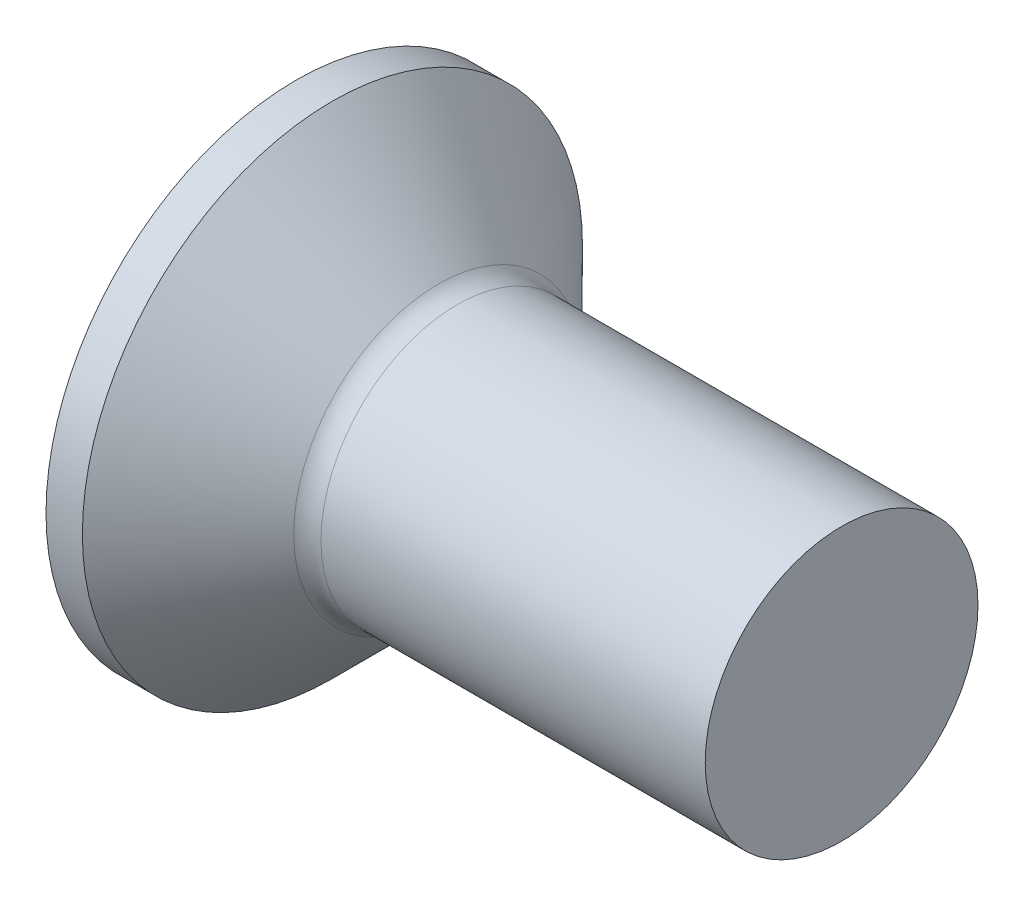
ISO-10303-21;
HEADER;
FILE_DESCRIPTION(('STEP AP214'),'2;1');
FILE_NAME('part.step','',(''),(''),'','','');
FILE_SCHEMA(('AUTOMOTIVE_DESIGN { 1 0 10303 214 1 1 1 1 }'));
ENDSEC;
DATA;
#1=APPLICATION_CONTEXT('core data for automotive mechanical design processes');
#2=APPLICATION_PROTOCOL_DEFINITION('international standard','automotive_design',2000,#1);
#3=PRODUCT_CONTEXT('',#1,'mechanical');
#4=PRODUCT('Part','Part','',(#3));
#5=PRODUCT_RELATED_PRODUCT_CATEGORY('part','',(#4));
#6=PRODUCT_DEFINITION_FORMATION('','',#4);
#7=PRODUCT_DEFINITION_CONTEXT('part definition',#1,'design');
#8=PRODUCT_DEFINITION('design','',#6,#7);
#9=PRODUCT_DEFINITION_SHAPE('','',#8);
#10=(LENGTH_UNIT() NAMED_UNIT(*) SI_UNIT(.MILLI.,.METRE.));
#11=(NAMED_UNIT(*) PLANE_ANGLE_UNIT() SI_UNIT($,.RADIAN.));
#12=(NAMED_UNIT(*) SI_UNIT($,.STERADIAN.) SOLID_ANGLE_UNIT());
#13=UNCERTAINTY_MEASURE_WITH_UNIT(LENGTH_MEASURE(1.E-05),#10,'distance_accuracy_value','');
#14=(GEOMETRIC_REPRESENTATION_CONTEXT(3) GLOBAL_UNCERTAINTY_ASSIGNED_CONTEXT((#13)) GLOBAL_UNIT_ASSIGNED_CONTEXT((#10,
#11,#12)) REPRESENTATION_CONTEXT('',''));
#15=CARTESIAN_POINT('',(0.,0.,0.));
#16=DIRECTION('',(0.,0.,1.));
#17=DIRECTION('',(1.,0.,0.));
#18=AXIS2_PLACEMENT_3D('',#15,#16,#17);
#19=CARTESIAN_POINT('',(0.,0.,0.));
#20=DIRECTION('',(1.,0.,0.));
#21=DIRECTION('',(0.,0.,-1.));
#22=AXIS2_PLACEMENT_3D('',#19,#20,#21);
#23=PLANE('',#22);
#24=CARTESIAN_POINT('',(0.,0.,0.));
#25=DIRECTION('',(-1.,0.,0.));
#26=DIRECTION('',(0.,0.,1.));
#27=AXIS2_PLACEMENT_3D('',#24,#25,#26);
#28=CIRCLE('',#27,2.75);
#29=CARTESIAN_POINT('',(0.,0.,2.75));
#30=VERTEX_POINT('',#29);
#31=EDGE_CURVE('E732',#30,#30,#28,.T.);
#32=ORIENTED_EDGE('',*,*,#31,.T.);
#33=EDGE_LOOP('',(#32));
#34=FACE_BOUND('',#33,.T.);
#35=CARTESIAN_POINT('',(0.,0.,0.));
#36=DIRECTION('',(-1.,0.,0.));
#37=DIRECTION('',(0.,0.,1.));
#38=AXIS2_PLACEMENT_3D('',#35,#36,#37);
#39=CIRCLE('',#38,0.7623);
#40=CARTESIAN_POINT('',(0.,-0.346499999999998,-0.678998556699498));
#41=VERTEX_POINT('',#40);
#42=CARTESIAN_POINT('',(0.,-0.678998556699496,-0.346500000000001));
#43=VERTEX_POINT('',#42);
#44=EDGE_CURVE('E634',#41,#43,#39,.T.);
#45=ORIENTED_EDGE('',*,*,#44,.F.);
#46=DIRECTION('',(0.,0.,1.));
#47=VECTOR('',#46,1.);
#48=CARTESIAN_POINT('',(0.,-0.346500000000005,1.575));
#49=LINE('',#48,#47);
#50=CARTESIAN_POINT('',(0.,-0.346499999999995,-1.575));
#51=VERTEX_POINT('',#50);
#52=EDGE_CURVE('E429',#51,#41,#49,.T.);
#53=ORIENTED_EDGE('',*,*,#52,.F.);
#54=DIRECTION('',(0.,-1.,0.));
#55=VECTOR('',#54,1.);
#56=CARTESIAN_POINT('',(0.,0.346500000000005,-1.575));
#57=LINE('',#56,#55);
#58=CARTESIAN_POINT('',(0.,0.346500000000005,-1.575));
#59=VERTEX_POINT('',#58);
#60=EDGE_CURVE('E227',#59,#51,#57,.T.);
#61=ORIENTED_EDGE('',*,*,#60,.F.);
#62=DIRECTION('',(0.,0.,-1.));
#63=VECTOR('',#62,1.);
#64=CARTESIAN_POINT('',(0.,0.346499999999995,1.575));
#65=LINE('',#64,#63);
#66=CARTESIAN_POINT('',(0.,0.346500000000003,-0.678998556699495));
#67=VERTEX_POINT('',#66);
#68=EDGE_CURVE('E439',#67,#59,#65,.T.);
#69=ORIENTED_EDGE('',*,*,#68,.F.);
#70=CARTESIAN_POINT('',(0.,0.678998556699496,-0.3465));
#71=VERTEX_POINT('',#70);
#72=EDGE_CURVE('E632',#71,#67,#39,.T.);
#73=ORIENTED_EDGE('',*,*,#72,.F.);
#74=DIRECTION('',(0.,-1.,0.));
#75=VECTOR('',#74,1.);
#76=CARTESIAN_POINT('',(0.,1.575,-0.3465));
#77=LINE('',#76,#75);
#78=CARTESIAN_POINT('',(0.,1.575,-0.3465));
#79=VERTEX_POINT('',#78);
#80=EDGE_CURVE('E564',#79,#71,#77,.T.);
#81=ORIENTED_EDGE('',*,*,#80,.F.);
#82=DIRECTION('',(0.,0.,-1.));
#83=VECTOR('',#82,1.);
#84=CARTESIAN_POINT('',(0.,1.575,-0.3465));
#85=LINE('',#84,#83);
#86=CARTESIAN_POINT('',(0.,1.575,0.3465));
#87=VERTEX_POINT('',#86);
#88=EDGE_CURVE('E661',#87,#79,#85,.T.);
#89=ORIENTED_EDGE('',*,*,#88,.F.);
#90=DIRECTION('',(0.,1.,0.));
#91=VECTOR('',#90,1.);
#92=CARTESIAN_POINT('',(0.,1.575,0.3465));
#93=LINE('',#92,#91);
#94=CARTESIAN_POINT('',(0.,0.678998556699497,0.3465));
#95=VERTEX_POINT('',#94);
#96=EDGE_CURVE('E78',#95,#87,#93,.T.);
#97=ORIENTED_EDGE('',*,*,#96,.F.);
#98=CARTESIAN_POINT('',(0.,0.346499999999998,0.678998556699498));
#99=VERTEX_POINT('',#98);
#100=EDGE_CURVE('E629',#99,#95,#39,.T.);
#101=ORIENTED_EDGE('',*,*,#100,.F.);
#102=CARTESIAN_POINT('',(0.,0.346499999999995,1.575));
#103=VERTEX_POINT('',#102);
#104=EDGE_CURVE('E427',#103,#99,#65,.T.);
#105=ORIENTED_EDGE('',*,*,#104,.F.);
#106=DIRECTION('',(0.,1.,0.));
#107=VECTOR('',#106,1.);
#108=CARTESIAN_POINT('',(0.,0.346499999999995,1.575));
#109=LINE('',#108,#107);
#110=CARTESIAN_POINT('',(0.,-0.346500000000005,1.575));
#111=VERTEX_POINT('',#110);
#112=EDGE_CURVE('E359',#111,#103,#109,.T.);
#113=ORIENTED_EDGE('',*,*,#112,.F.);
#114=CARTESIAN_POINT('',(0.,-0.346500000000002,0.678998556699496));
#115=VERTEX_POINT('',#114);
#116=EDGE_CURVE('E426',#115,#111,#49,.T.);
#117=ORIENTED_EDGE('',*,*,#116,.F.);
#118=CARTESIAN_POINT('',(0.,-0.678998556699497,0.3465));
#119=VERTEX_POINT('',#118);
#120=EDGE_CURVE('E607',#119,#115,#39,.T.);
#121=ORIENTED_EDGE('',*,*,#120,.F.);
#122=CARTESIAN_POINT('',(0.,-1.575,0.3465));
#123=VERTEX_POINT('',#122);
#124=EDGE_CURVE('E645',#123,#119,#93,.T.);
#125=ORIENTED_EDGE('',*,*,#124,.F.);
#126=DIRECTION('',(0.,0.,1.));
#127=VECTOR('',#126,1.);
#128=CARTESIAN_POINT('',(0.,-1.575,-0.3465));
#129=LINE('',#128,#127);
#130=CARTESIAN_POINT('',(0.,-1.575,-0.3465));
#131=VERTEX_POINT('',#130);
#132=EDGE_CURVE('E557',#131,#123,#129,.T.);
#133=ORIENTED_EDGE('',*,*,#132,.F.);
#134=EDGE_CURVE('E561',#43,#131,#77,.T.);
#135=ORIENTED_EDGE('',*,*,#134,.F.);
#136=EDGE_LOOP('',(#45,#53,#61,#69,#73,#81,#89,#97,#101,#105,#113,#117,#121,#125,#133,#135));
#137=FACE_BOUND('',#136,.T.);
#138=ADVANCED_FACE('F52',(#34,#137),#23,.F.);
#139=CARTESIAN_POINT('',(1.86,-0.647638364104692,0.3465));
#140=DIRECTION('',(0.,0.,-1.));
#141=DIRECTION('',(-1.,0.,0.));
#142=AXIS2_PLACEMENT_3D('',#139,#140,#141);
#143=PLANE('',#142);
#144=ORIENTED_EDGE('',*,*,#124,.T.);
#145=CARTESIAN_POINT('',(-0.000199999999999989,-0.679014257787779,0.3465));
#146=CARTESIAN_POINT('',(0.236606189027903,-0.660413380015154,0.3465));
#147=CARTESIAN_POINT('',(0.473401828028878,-0.641674112311925,0.3465));
#148=CARTESIAN_POINT('',(0.946959624916106,-0.603785736586839,0.3465));
#149=CARTESIAN_POINT('',(1.18372178289219,-0.584636629686428,0.3465));
#150=CARTESIAN_POINT('',(1.56705011284707,-0.553190853912894,0.3465));
#151=CARTESIAN_POINT('',(1.71363002451431,-0.541061591176943,0.3465));
#152=CARTESIAN_POINT('',(1.8602,-0.528812433570195,0.3465));
#153=B_SPLINE_CURVE_WITH_KNOTS('',3,(#145,#146,#147,#148,#149,#150,#151,#152),.UNSPECIFIED.,.F.,
.F.,(4,2,2,4),(0.,0.712607301280214,1.42521265289613,1.86645525161499),.UNSPECIFIED.);
#154=CARTESIAN_POINT('',(1.86,-0.528829153702424,0.346499999999999));
#155=VERTEX_POINT('',#154);
#156=EDGE_CURVE('E334',#119,#155,#153,.T.);
#157=ORIENTED_EDGE('',*,*,#156,.T.);
#158=DIRECTION('',(0.,-1.,0.));
#159=VECTOR('',#158,1.);
#160=CARTESIAN_POINT('',(1.86,0.647638364104693,0.3465));
#161=LINE('',#160,#159);
#162=CARTESIAN_POINT('',(1.86,-0.647638364104692,0.3465));
#163=VERTEX_POINT('',#162);
#164=EDGE_CURVE('E537',#155,#163,#161,.T.);
#165=ORIENTED_EDGE('',*,*,#164,.T.);
#166=DIRECTION('',(0.894934391398442,0.446197753347436,0.));
#167=VECTOR('',#166,1.);
#168=CARTESIAN_POINT('',(0.,-1.575,0.3465));
#169=LINE('',#168,#167);
#170=EDGE_CURVE('E555',#123,#163,#169,.T.);
#171=ORIENTED_EDGE('',*,*,#170,.F.);
#172=EDGE_LOOP('',(#144,#157,#165,#171));
#173=FACE_BOUND('',#172,.T.);
#174=ADVANCED_FACE('F184',(#173),#143,.T.);
#175=CARTESIAN_POINT('',(1.86,0.647638364104693,0.3465));
#176=VERTEX_POINT('',#175);
#177=CARTESIAN_POINT('',(1.86,0.528829153702424,0.346499999999999));
#178=VERTEX_POINT('',#177);
#179=EDGE_CURVE('E534',#176,#178,#161,.T.);
#180=ORIENTED_EDGE('',*,*,#179,.T.);
#181=CARTESIAN_POINT('',(1.8602,0.528812433570195,0.3465));
#182=CARTESIAN_POINT('',(1.66388483871382,0.545218893036116,0.3465));
#183=CARTESIAN_POINT('',(1.46755175904104,0.561409078584737,0.3465));
#184=CARTESIAN_POINT('',(1.07485715491275,0.593436471085346,0.3465));
#185=CARTESIAN_POINT('',(0.878495630510803,0.609273678693523,0.3465));
#186=CARTESIAN_POINT('',(0.568409491805524,0.634065947381106,0.3465));
#187=CARTESIAN_POINT('',(0.454692116755951,0.643111852686441,0.3465));
#188=CARTESIAN_POINT('',(0.227250769123921,0.661121904170995,0.3465));
#189=CARTESIAN_POINT('',(0.113526796534547,0.670086050262893,0.3465));
#190=CARTESIAN_POINT('',(-0.000199999999999985,0.679014257787779,0.3465));
#191=B_SPLINE_CURVE_WITH_KNOTS('',3,(#181,#182,#183,#184,#185,#186,#187,#188,#189,#190),
.UNSPECIFIED.,.F.,.F.,(4,2,2,2,4),(0.,0.590998249941937,1.1819954011213,1.52422516902128,
1.86645530239),.UNSPECIFIED.);
#192=EDGE_CURVE('E333',#178,#95,#191,.T.);
#193=ORIENTED_EDGE('',*,*,#192,.T.);
#194=ORIENTED_EDGE('',*,*,#96,.T.);
#195=DIRECTION('',(0.894934391398443,-0.446197753347436,0.));
#196=VECTOR('',#195,1.);
#197=CARTESIAN_POINT('',(0.,1.575,0.3465));
#198=LINE('',#197,#196);
#199=EDGE_CURVE('E595',#87,#176,#198,.T.);
#200=ORIENTED_EDGE('',*,*,#199,.T.);
#201=EDGE_LOOP('',(#180,#193,#194,#200));
#202=FACE_BOUND('',#201,.T.);
#203=ADVANCED_FACE('F189',(#202),#143,.T.);
#204=CARTESIAN_POINT('',(1.86,0.647638364104692,-0.3465));
#205=DIRECTION('',(0.,0.,1.));
#206=DIRECTION('',(0.,-1.,0.));
#207=AXIS2_PLACEMENT_3D('',#204,#205,#206);
#208=PLANE('',#207);
#209=DIRECTION('',(0.,1.,0.));
#210=VECTOR('',#209,1.);
#211=CARTESIAN_POINT('',(1.86,0.647638364104693,-0.3465));
#212=LINE('',#211,#210);
#213=CARTESIAN_POINT('',(1.86,-0.647638364104693,-0.3465));
#214=VERTEX_POINT('',#213);
#215=CARTESIAN_POINT('',(1.86,-0.528829153702424,-0.3465));
#216=VERTEX_POINT('',#215);
#217=EDGE_CURVE('E409',#214,#216,#212,.T.);
#218=ORIENTED_EDGE('',*,*,#217,.T.);
#219=CARTESIAN_POINT('',(1.8602,-0.528812433570194,-0.3465));
#220=CARTESIAN_POINT('',(1.66388483871382,-0.545218893036116,-0.3465));
#221=CARTESIAN_POINT('',(1.46755175904104,-0.561409078584736,-0.3465));
#222=CARTESIAN_POINT('',(1.07485715491275,-0.593436471085345,-0.3465));
#223=CARTESIAN_POINT('',(0.878495630510803,-0.609273678693523,-0.3465));
#224=CARTESIAN_POINT('',(0.568409491805524,-0.634065947381106,-0.3465));
#225=CARTESIAN_POINT('',(0.454692116755951,-0.643111852686441,-0.3465));
#226=CARTESIAN_POINT('',(0.227250769123921,-0.661121904170995,-0.3465));
#227=CARTESIAN_POINT('',(0.113526796534547,-0.670086050262893,-0.3465));
#228=CARTESIAN_POINT('',(-0.000199999999999997,-0.679014257787779,-0.3465));
#229=B_SPLINE_CURVE_WITH_KNOTS('',3,(#219,#220,#221,#222,#223,#224,#225,#226,#227,#228),
.UNSPECIFIED.,.F.,.F.,(4,2,2,2,4),(0.,0.590998249941937,1.1819954011213,1.52422516902128,
1.86645530239),.UNSPECIFIED.);
#230=EDGE_CURVE('E639',#216,#43,#229,.T.);
#231=ORIENTED_EDGE('',*,*,#230,.T.);
#232=ORIENTED_EDGE('',*,*,#134,.T.);
#233=DIRECTION('',(0.894934391398442,0.446197753347436,0.));
#234=VECTOR('',#233,1.);
#235=CARTESIAN_POINT('',(0.,-1.575,-0.3465));
#236=LINE('',#235,#234);
#237=EDGE_CURVE('E562',#131,#214,#236,.T.);
#238=ORIENTED_EDGE('',*,*,#237,.T.);
#239=EDGE_LOOP('',(#218,#231,#232,#238));
#240=FACE_BOUND('',#239,.T.);
#241=ADVANCED_FACE('F339',(#240),#208,.T.);
#242=ORIENTED_EDGE('',*,*,#80,.T.);
#243=CARTESIAN_POINT('',(-0.0002,0.679014257787778,-0.3465));
#244=CARTESIAN_POINT('',(0.236606189027903,0.660413380015153,-0.3465));
#245=CARTESIAN_POINT('',(0.473401828028878,0.641674112311924,-0.3465));
#246=CARTESIAN_POINT('',(0.946959624916106,0.603785736586838,-0.3465));
#247=CARTESIAN_POINT('',(1.18372178289219,0.584636629686428,-0.3465));
#248=CARTESIAN_POINT('',(1.56705011284707,0.553190853912894,-0.3465));
#249=CARTESIAN_POINT('',(1.71363002451431,0.541061591176943,-0.3465));
#250=CARTESIAN_POINT('',(1.8602,0.528812433570195,-0.3465));
#251=B_SPLINE_CURVE_WITH_KNOTS('',3,(#243,#244,#245,#246,#247,#248,#249,#250),.UNSPECIFIED.,.F.,
.F.,(4,2,2,4),(0.,0.712607301280214,1.42521265289613,1.86645525161499),.UNSPECIFIED.);
#252=CARTESIAN_POINT('',(1.86,0.528829153702424,-0.3465));
#253=VERTEX_POINT('',#252);
#254=EDGE_CURVE('E644',#71,#253,#251,.T.);
#255=ORIENTED_EDGE('',*,*,#254,.T.);
#256=CARTESIAN_POINT('',(1.86,0.647638364104693,-0.3465));
#257=VERTEX_POINT('',#256);
#258=EDGE_CURVE('E538',#253,#257,#212,.T.);
#259=ORIENTED_EDGE('',*,*,#258,.T.);
#260=DIRECTION('',(0.894934391398443,-0.446197753347436,0.));
#261=VECTOR('',#260,1.);
#262=CARTESIAN_POINT('',(0.,1.575,-0.3465));
#263=LINE('',#262,#261);
#264=EDGE_CURVE('E565',#79,#257,#263,.T.);
#265=ORIENTED_EDGE('',*,*,#264,.F.);
#266=EDGE_LOOP('',(#242,#255,#259,#265));
#267=FACE_BOUND('',#266,.T.);
#268=ADVANCED_FACE('F465',(#267),#208,.T.);
#269=CARTESIAN_POINT('',(1.86,0.647638364104693,-0.3465));
#270=DIRECTION('',(-1.,0.,0.));
#271=DIRECTION('',(0.,0.,1.));
#272=AXIS2_PLACEMENT_3D('',#269,#270,#271);
#273=PLANE('',#272);
#274=ORIENTED_EDGE('',*,*,#164,.F.);
#275=CARTESIAN_POINT('',(1.86,0.,0.));
#276=DIRECTION('',(-1.,0.,0.));
#277=DIRECTION('',(0.,0.,1.));
#278=AXIS2_PLACEMENT_3D('',#275,#276,#277);
#279=CIRCLE('',#278,0.632236129785084);
#280=EDGE_CURVE('E619',#216,#155,#279,.T.);
#281=ORIENTED_EDGE('',*,*,#280,.F.);
#282=ORIENTED_EDGE('',*,*,#217,.F.);
#283=DIRECTION('',(0.,0.,-1.));
#284=VECTOR('',#283,1.);
#285=CARTESIAN_POINT('',(1.86,-0.647638364104693,-0.3465));
#286=LINE('',#285,#284);
#287=EDGE_CURVE('E543',#163,#214,#286,.T.);
#288=ORIENTED_EDGE('',*,*,#287,.F.);
#289=EDGE_LOOP('',(#274,#281,#282,#288));
#290=FACE_BOUND('',#289,.T.);
#291=ADVANCED_FACE('F455',(#290),#273,.T.);
#292=DIRECTION('',(0.,0.,-1.));
#293=VECTOR('',#292,1.);
#294=CARTESIAN_POINT('',(1.86,-0.346500000000002,0.647638364104691));
#295=LINE('',#294,#293);
#296=CARTESIAN_POINT('',(1.86,-0.346499999999998,-0.528829153702425));
#297=VERTEX_POINT('',#296);
#298=CARTESIAN_POINT('',(1.86,-0.346499999999997,-0.647638364104694));
#299=VERTEX_POINT('',#298);
#300=EDGE_CURVE('E396',#297,#299,#295,.T.);
#301=ORIENTED_EDGE('',*,*,#300,.F.);
#302=CARTESIAN_POINT('',(1.86,0.346500000000002,-0.528829153702422));
#303=VERTEX_POINT('',#302);
#304=EDGE_CURVE('E609',#303,#297,#279,.T.);
#305=ORIENTED_EDGE('',*,*,#304,.F.);
#306=DIRECTION('',(0.,0.,1.));
#307=VECTOR('',#306,1.);
#308=CARTESIAN_POINT('',(1.86,0.346499999999998,0.647638364104694));
#309=LINE('',#308,#307);
#310=CARTESIAN_POINT('',(1.86,0.346500000000003,-0.647638364104691));
#311=VERTEX_POINT('',#310);
#312=EDGE_CURVE('E403',#311,#303,#309,.T.);
#313=ORIENTED_EDGE('',*,*,#312,.F.);
#314=DIRECTION('',(0.,1.,0.));
#315=VECTOR('',#314,1.);
#316=CARTESIAN_POINT('',(1.86,0.346500000000003,-0.647638364104691));
#317=LINE('',#316,#315);
#318=EDGE_CURVE('E398',#299,#311,#317,.T.);
#319=ORIENTED_EDGE('',*,*,#318,.F.);
#320=EDGE_LOOP('',(#301,#305,#313,#319));
#321=FACE_BOUND('',#320,.T.);
#322=ADVANCED_FACE('F464',(#321),#273,.T.);
#323=ORIENTED_EDGE('',*,*,#258,.F.);
#324=EDGE_CURVE('E601',#178,#253,#279,.T.);
#325=ORIENTED_EDGE('',*,*,#324,.F.);
#326=ORIENTED_EDGE('',*,*,#179,.F.);
#327=DIRECTION('',(0.,0.,1.));
#328=VECTOR('',#327,1.);
#329=CARTESIAN_POINT('',(1.86,0.647638364104693,-0.3465));
#330=LINE('',#329,#328);
#331=EDGE_CURVE('E536',#257,#176,#330,.T.);
#332=ORIENTED_EDGE('',*,*,#331,.F.);
#333=EDGE_LOOP('',(#323,#325,#326,#332));
#334=FACE_BOUND('',#333,.T.);
#335=ADVANCED_FACE('F599',(#334),#273,.T.);
#336=CARTESIAN_POINT('',(1.86,0.346499999999998,0.528829153702426));
#337=VERTEX_POINT('',#336);
#338=CARTESIAN_POINT('',(1.86,0.346499999999998,0.647638364104694));
#339=VERTEX_POINT('',#338);
#340=EDGE_CURVE('E524',#337,#339,#309,.T.);
#341=ORIENTED_EDGE('',*,*,#340,.F.);
#342=CARTESIAN_POINT('',(1.86,-0.346500000000002,0.528829153702423));
#343=VERTEX_POINT('',#342);
#344=EDGE_CURVE('E525',#343,#337,#279,.T.);
#345=ORIENTED_EDGE('',*,*,#344,.F.);
#346=CARTESIAN_POINT('',(1.86,-0.346500000000002,0.647638364104691));
#347=VERTEX_POINT('',#346);
#348=EDGE_CURVE('E56',#347,#343,#295,.T.);
#349=ORIENTED_EDGE('',*,*,#348,.F.);
#350=DIRECTION('',(0.,-1.,0.));
#351=VECTOR('',#350,1.);
#352=CARTESIAN_POINT('',(1.86,0.346499999999998,0.647638364104694));
#353=LINE('',#352,#351);
#354=EDGE_CURVE('E395',#339,#347,#353,.T.);
#355=ORIENTED_EDGE('',*,*,#354,.F.);
#356=EDGE_LOOP('',(#341,#345,#349,#355));
#357=FACE_BOUND('',#356,.T.);
#358=ADVANCED_FACE('F255',(#357),#273,.T.);
#359=CARTESIAN_POINT('',(1.86,-0.346499999999997,-0.647638364104694));
#360=DIRECTION('',(0.,1.,0.));
#361=DIRECTION('',(-1.,0.,0.));
#362=AXIS2_PLACEMENT_3D('',#359,#360,#361);
#363=PLANE('',#362);
#364=ORIENTED_EDGE('',*,*,#52,.T.);
#365=CARTESIAN_POINT('',(-0.0002,-0.346499999999998,-0.67901425778778));
#366=CARTESIAN_POINT('',(0.236606189027903,-0.346499999999998,-0.660413380015154));
#367=CARTESIAN_POINT('',(0.473401828028878,-0.346499999999998,-0.641674112311926));
#368=CARTESIAN_POINT('',(0.946959624916106,-0.346499999999998,-0.60378573658684));
#369=CARTESIAN_POINT('',(1.18372178289219,-0.346499999999998,-0.584636629686429));
#370=CARTESIAN_POINT('',(1.56705011284707,-0.346499999999998,-0.553190853912896));
#371=CARTESIAN_POINT('',(1.71363002451431,-0.346499999999998,-0.541061591176944));
#372=CARTESIAN_POINT('',(1.8602,-0.346499999999998,-0.528812433570196));
#373=B_SPLINE_CURVE_WITH_KNOTS('',3,(#365,#366,#367,#368,#369,#370,#371,#372),.UNSPECIFIED.,.F.,
.F.,(4,2,2,4),(0.,0.712607301280214,1.42521265289613,1.86645525161499),.UNSPECIFIED.);
#374=EDGE_CURVE('E640',#41,#297,#373,.T.);
#375=ORIENTED_EDGE('',*,*,#374,.T.);
#376=ORIENTED_EDGE('',*,*,#300,.T.);
#377=DIRECTION('',(0.894934391398442,0.,0.446197753347436));
#378=VECTOR('',#377,1.);
#379=CARTESIAN_POINT('',(0.,-0.346499999999995,-1.575));
#380=LINE('',#379,#378);
#381=EDGE_CURVE('E440',#51,#299,#380,.T.);
#382=ORIENTED_EDGE('',*,*,#381,.F.);
#383=EDGE_LOOP('',(#364,#375,#376,#382));
#384=FACE_BOUND('',#383,.T.);
#385=ADVANCED_FACE('F245',(#384),#363,.T.);
#386=CARTESIAN_POINT('',(1.86,0.346499999999998,0.647638364104694));
#387=DIRECTION('',(0.,-1.,0.));
#388=DIRECTION('',(0.,0.,-1.));
#389=AXIS2_PLACEMENT_3D('',#386,#387,#388);
#390=PLANE('',#389);
#391=ORIENTED_EDGE('',*,*,#312,.T.);
#392=CARTESIAN_POINT('',(1.8602,0.346500000000002,-0.528812433570193));
#393=CARTESIAN_POINT('',(1.66388483871382,0.346500000000002,-0.545218893036115));
#394=CARTESIAN_POINT('',(1.46755175904104,0.346500000000002,-0.561409078584735));
#395=CARTESIAN_POINT('',(1.07485715491275,0.346500000000002,-0.593436471085344));
#396=CARTESIAN_POINT('',(0.878495630510803,0.346500000000003,-0.609273678693522));
#397=CARTESIAN_POINT('',(0.568409491805524,0.346500000000003,-0.634065947381105));
#398=CARTESIAN_POINT('',(0.454692116755952,0.346500000000003,-0.643111852686439));
#399=CARTESIAN_POINT('',(0.227250769123921,0.346500000000003,-0.661121904170993));
#400=CARTESIAN_POINT('',(0.113526796534547,0.346500000000003,-0.670086050262892));
#401=CARTESIAN_POINT('',(-0.000199999999999977,0.346500000000003,-0.679014257787777));
#402=B_SPLINE_CURVE_WITH_KNOTS('',3,(#392,#393,#394,#395,#396,#397,#398,#399,#400,#401),
.UNSPECIFIED.,.F.,.F.,(4,2,2,2,4),(0.,0.590998249941937,1.1819954011213,1.52422516902128,
1.86645530239),.UNSPECIFIED.);
#403=EDGE_CURVE('E281',#303,#67,#402,.T.);
#404=ORIENTED_EDGE('',*,*,#403,.T.);
#405=ORIENTED_EDGE('',*,*,#68,.T.);
#406=DIRECTION('',(0.894934391398442,0.,0.446197753347436));
#407=VECTOR('',#406,1.);
#408=CARTESIAN_POINT('',(0.,0.346500000000005,-1.575));
#409=LINE('',#408,#407);
#410=EDGE_CURVE('E670',#59,#311,#409,.T.);
#411=ORIENTED_EDGE('',*,*,#410,.T.);
#412=EDGE_LOOP('',(#391,#404,#405,#411));
#413=FACE_BOUND('',#412,.T.);
#414=ADVANCED_FACE('F254',(#413),#390,.T.);
#415=ORIENTED_EDGE('',*,*,#348,.T.);
#416=CARTESIAN_POINT('',(1.8602,-0.346500000000002,0.528812433570193));
#417=CARTESIAN_POINT('',(1.66388483871382,-0.346500000000002,0.545218893036115));
#418=CARTESIAN_POINT('',(1.46755175904104,-0.346500000000002,0.561409078584735));
#419=CARTESIAN_POINT('',(1.07485715491275,-0.346500000000002,0.593436471085345));
#420=CARTESIAN_POINT('',(0.878495630510803,-0.346500000000002,0.609273678693522));
#421=CARTESIAN_POINT('',(0.568409491805524,-0.346500000000002,0.634065947381105));
#422=CARTESIAN_POINT('',(0.454692116755951,-0.346500000000002,0.64311185268644));
#423=CARTESIAN_POINT('',(0.227250769123921,-0.346500000000002,0.661121904170994));
#424=CARTESIAN_POINT('',(0.113526796534547,-0.346500000000002,0.670086050262892));
#425=CARTESIAN_POINT('',(-0.000200000000000004,-0.346500000000002,0.679014257787778));
#426=B_SPLINE_CURVE_WITH_KNOTS('',3,(#416,#417,#418,#419,#420,#421,#422,#423,#424,#425),
.UNSPECIFIED.,.F.,.F.,(4,2,2,2,4),(0.,0.590998249941937,1.1819954011213,1.52422516902128,
1.86645530239),.UNSPECIFIED.);
#427=EDGE_CURVE('E279',#343,#115,#426,.T.);
#428=ORIENTED_EDGE('',*,*,#427,.T.);
#429=ORIENTED_EDGE('',*,*,#116,.T.);
#430=DIRECTION('',(0.894934391398443,0.,-0.446197753347436));
#431=VECTOR('',#430,1.);
#432=CARTESIAN_POINT('',(0.,-0.346500000000005,1.575));
#433=LINE('',#432,#431);
#434=EDGE_CURVE('E364',#111,#347,#433,.T.);
#435=ORIENTED_EDGE('',*,*,#434,.T.);
#436=EDGE_LOOP('',(#415,#428,#429,#435));
#437=FACE_BOUND('',#436,.T.);
#438=ADVANCED_FACE('F257',(#437),#363,.T.);
#439=ORIENTED_EDGE('',*,*,#104,.T.);
#440=CARTESIAN_POINT('',(-0.0002,0.346499999999998,0.67901425778778));
#441=CARTESIAN_POINT('',(0.236606189027903,0.346499999999998,0.660413380015154));
#442=CARTESIAN_POINT('',(0.473401828028878,0.346499999999998,0.641674112311926));
#443=CARTESIAN_POINT('',(0.946959624916106,0.346499999999998,0.60378573658684));
#444=CARTESIAN_POINT('',(1.18372178289219,0.346499999999998,0.584636629686429));
#445=CARTESIAN_POINT('',(1.56705011284707,0.346499999999998,0.553190853912895));
#446=CARTESIAN_POINT('',(1.71363002451431,0.346499999999998,0.541061591176944));
#447=CARTESIAN_POINT('',(1.8602,0.346499999999998,0.528812433570196));
#448=B_SPLINE_CURVE_WITH_KNOTS('',3,(#440,#441,#442,#443,#444,#445,#446,#447),.UNSPECIFIED.,.F.,
.F.,(4,2,2,4),(0.,0.712607301280214,1.42521265289613,1.86645525161499),.UNSPECIFIED.);
#449=EDGE_CURVE('E12',#99,#337,#448,.T.);
#450=ORIENTED_EDGE('',*,*,#449,.T.);
#451=ORIENTED_EDGE('',*,*,#340,.T.);
#452=DIRECTION('',(0.894934391398443,0.,-0.446197753347436));
#453=VECTOR('',#452,1.);
#454=CARTESIAN_POINT('',(0.,0.346499999999995,1.575));
#455=LINE('',#454,#453);
#456=EDGE_CURVE('E669',#103,#339,#455,.T.);
#457=ORIENTED_EDGE('',*,*,#456,.F.);
#458=EDGE_LOOP('',(#439,#450,#451,#457));
#459=FACE_BOUND('',#458,.T.);
#460=ADVANCED_FACE('F625',(#459),#390,.T.);
#461=CARTESIAN_POINT('',(0.,0.,0.));
#462=DIRECTION('',(-1.,0.,0.));
#463=DIRECTION('',(0.,0.,1.));
#464=AXIS2_PLACEMENT_3D('',#461,#462,#463);
#465=CYLINDRICAL_SURFACE('',#464,2.75);
#466=ORIENTED_EDGE('',*,*,#31,.F.);
#467=EDGE_LOOP('',(#466));
#468=FACE_BOUND('',#467,.T.);
#469=CARTESIAN_POINT('',(0.400000000000003,0.,0.));
#470=DIRECTION('',(-1.,0.,0.));
#471=DIRECTION('',(0.,0.,1.));
#472=AXIS2_PLACEMENT_3D('',#469,#470,#471);
#473=CIRCLE('',#472,2.75);
#474=CARTESIAN_POINT('',(0.400000000000003,0.,2.75));
#475=VERTEX_POINT('',#474);
#476=EDGE_CURVE('E668',#475,#475,#473,.T.);
#477=ORIENTED_EDGE('',*,*,#476,.T.);
#478=EDGE_LOOP('',(#477));
#479=FACE_BOUND('',#478,.T.);
#480=ADVANCED_FACE('F196',(#468,#479),#465,.T.);
#481=CARTESIAN_POINT('',(1.65,0.,0.));
#482=DIRECTION('',(-1.,0.,0.));
#483=DIRECTION('',(0.,0.,1.));
#484=AXIS2_PLACEMENT_3D('',#481,#482,#483);
#485=CONICAL_SURFACE('',#484,1.5,0.78539816339745);
#486=CARTESIAN_POINT('',(1.56213203435596,0.,0.));
#487=DIRECTION('',(-1.,0.,0.));
#488=DIRECTION('',(0.,0.,1.));
#489=AXIS2_PLACEMENT_3D('',#486,#487,#488);
#490=CIRCLE('',#489,1.58786796564404);
#491=CARTESIAN_POINT('',(1.56213203435596,0.,1.58786796564404));
#492=VERTEX_POINT('',#491);
#493=EDGE_CURVE('E730',#492,#492,#490,.T.);
#494=ORIENTED_EDGE('',*,*,#493,.T.);
#495=EDGE_LOOP('',(#494));
#496=FACE_BOUND('',#495,.T.);
#497=ORIENTED_EDGE('',*,*,#476,.F.);
#498=EDGE_LOOP('',(#497));
#499=FACE_BOUND('',#498,.T.);
#500=ADVANCED_FACE('F741',(#496,#499),#485,.T.);
#501=CARTESIAN_POINT('',(0.,0.,0.));
#502=DIRECTION('',(-1.,0.,0.));
#503=DIRECTION('',(0.,0.,1.));
#504=AXIS2_PLACEMENT_3D('',#501,#502,#503);
#505=CYLINDRICAL_SURFACE('',#504,1.5);
#506=CARTESIAN_POINT('',(1.77426406871193,0.,0.));
#507=DIRECTION('',(-1.,0.,0.));
#508=DIRECTION('',(0.,0.,1.));
#509=AXIS2_PLACEMENT_3D('',#506,#507,#508);
#510=CIRCLE('',#509,1.5);
#511=CARTESIAN_POINT('',(1.77426406871193,0.,1.5));
#512=VERTEX_POINT('',#511);
#513=EDGE_CURVE('E62',#512,#512,#510,.F.);
#514=ORIENTED_EDGE('',*,*,#513,.T.);
#515=EDGE_LOOP('',(#514));
#516=FACE_BOUND('',#515,.T.);
#517=CARTESIAN_POINT('',(6.,0.,0.));
#518=DIRECTION('',(-1.,0.,0.));
#519=DIRECTION('',(0.,0.,1.));
#520=AXIS2_PLACEMENT_3D('',#517,#518,#519);
#521=CIRCLE('',#520,1.5);
#522=CARTESIAN_POINT('',(6.,0.,1.5));
#523=VERTEX_POINT('',#522);
#524=EDGE_CURVE('E662',#523,#523,#521,.T.);
#525=ORIENTED_EDGE('',*,*,#524,.T.);
#526=EDGE_LOOP('',(#525));
#527=FACE_BOUND('',#526,.T.);
#528=ADVANCED_FACE('F723',(#516,#527),#505,.T.);
#529=CARTESIAN_POINT('',(6.,1.5,0.));
#530=DIRECTION('',(-1.,0.,0.));
#531=DIRECTION('',(0.,0.,1.));
#532=AXIS2_PLACEMENT_3D('',#529,#530,#531);
#533=PLANE('',#532);
#534=ORIENTED_EDGE('',*,*,#524,.F.);
#535=EDGE_LOOP('',(#534));
#536=FACE_BOUND('',#535,.T.);
#537=ADVANCED_FACE('F469',(#536),#533,.F.);
#538=CARTESIAN_POINT('',(1.77426406871193,0.,0.));
#539=DIRECTION('',(-1.,0.,0.));
#540=DIRECTION('',(0.,0.,1.));
#541=AXIS2_PLACEMENT_3D('',#538,#539,#540);
#542=TOROIDAL_SURFACE('',#541,1.8,0.3);
#543=ORIENTED_EDGE('',*,*,#513,.F.);
#544=EDGE_LOOP('',(#543));
#545=FACE_BOUND('',#544,.T.);
#546=ORIENTED_EDGE('',*,*,#493,.F.);
#547=EDGE_LOOP('',(#546));
#548=FACE_BOUND('',#547,.T.);
#549=ADVANCED_FACE('F54',(#545,#548),#542,.F.);
#550=CARTESIAN_POINT('',(1.86,-0.647638364104693,-0.3465));
#551=DIRECTION('',(-0.446197753347436,0.894934391398442,0.));
#552=DIRECTION('',(-0.894934391398442,-0.446197753347436,0.));
#553=AXIS2_PLACEMENT_3D('',#550,#551,#552);
#554=PLANE('',#553);
#555=ORIENTED_EDGE('',*,*,#237,.F.);
#556=ORIENTED_EDGE('',*,*,#132,.T.);
#557=ORIENTED_EDGE('',*,*,#170,.T.);
#558=ORIENTED_EDGE('',*,*,#287,.T.);
#559=EDGE_LOOP('',(#555,#556,#557,#558));
#560=FACE_BOUND('',#559,.T.);
#561=ADVANCED_FACE('F337',(#560),#554,.T.);
#562=CARTESIAN_POINT('',(1.86,0.647638364104693,0.3465));
#563=DIRECTION('',(-0.446197753347436,-0.894934391398442,0.));
#564=DIRECTION('',(0.894934391398443,-0.446197753347436,0.));
#565=AXIS2_PLACEMENT_3D('',#562,#563,#564);
#566=PLANE('',#565);
#567=ORIENTED_EDGE('',*,*,#199,.F.);
#568=ORIENTED_EDGE('',*,*,#88,.T.);
#569=ORIENTED_EDGE('',*,*,#264,.T.);
#570=ORIENTED_EDGE('',*,*,#331,.T.);
#571=EDGE_LOOP('',(#567,#568,#569,#570));
#572=FACE_BOUND('',#571,.T.);
#573=ADVANCED_FACE('F467',(#572),#566,.T.);
#574=CARTESIAN_POINT('',(1.86,0.346500000000003,-0.647638364104691));
#575=DIRECTION('',(-0.446197753347436,0.,0.894934391398442));
#576=DIRECTION('',(-0.894934391398442,0.,-0.446197753347436));
#577=AXIS2_PLACEMENT_3D('',#574,#575,#576);
#578=PLANE('',#577);
#579=ORIENTED_EDGE('',*,*,#410,.F.);
#580=ORIENTED_EDGE('',*,*,#60,.T.);
#581=ORIENTED_EDGE('',*,*,#381,.T.);
#582=ORIENTED_EDGE('',*,*,#318,.T.);
#583=EDGE_LOOP('',(#579,#580,#581,#582));
#584=FACE_BOUND('',#583,.T.);
#585=ADVANCED_FACE('F258',(#584),#578,.T.);
#586=CARTESIAN_POINT('',(1.86,-0.346500000000002,0.647638364104691));
#587=DIRECTION('',(-0.446197753347436,0.,-0.894934391398442));
#588=DIRECTION('',(0.894934391398443,0.,-0.446197753347436));
#589=AXIS2_PLACEMENT_3D('',#586,#587,#588);
#590=PLANE('',#589);
#591=ORIENTED_EDGE('',*,*,#434,.F.);
#592=ORIENTED_EDGE('',*,*,#112,.T.);
#593=ORIENTED_EDGE('',*,*,#456,.T.);
#594=ORIENTED_EDGE('',*,*,#354,.T.);
#595=EDGE_LOOP('',(#591,#592,#593,#594));
#596=FACE_BOUND('',#595,.T.);
#597=ADVANCED_FACE('F366',(#596),#590,.T.);
#598=CARTESIAN_POINT('',(1.86,0.,0.));
#599=DIRECTION('',(-1.,0.,0.));
#600=DIRECTION('',(0.,0.,1.));
#601=AXIS2_PLACEMENT_3D('',#598,#599,#600);
#602=CONICAL_SURFACE('',#601,0.632236129785084,0.069813170079766);
#603=ORIENTED_EDGE('',*,*,#120,.T.);
#604=ORIENTED_EDGE('',*,*,#427,.F.);
#605=EDGE_CURVE('E622',#155,#343,#279,.T.);
#606=ORIENTED_EDGE('',*,*,#605,.F.);
#607=ORIENTED_EDGE('',*,*,#156,.F.);
#608=EDGE_LOOP('',(#603,#604,#606,#607));
#609=FACE_BOUND('',#608,.T.);
#610=ADVANCED_FACE('F182',(#609),#602,.F.);
#611=EDGE_CURVE('E70',#337,#178,#279,.T.);
#612=ORIENTED_EDGE('',*,*,#611,.F.);
#613=ORIENTED_EDGE('',*,*,#449,.F.);
#614=ORIENTED_EDGE('',*,*,#100,.T.);
#615=ORIENTED_EDGE('',*,*,#192,.F.);
#616=EDGE_LOOP('',(#612,#613,#614,#615));
#617=FACE_BOUND('',#616,.T.);
#618=ADVANCED_FACE('F628',(#617),#602,.F.);
#619=EDGE_CURVE('E616',#297,#216,#279,.T.);
#620=ORIENTED_EDGE('',*,*,#619,.F.);
#621=ORIENTED_EDGE('',*,*,#374,.F.);
#622=ORIENTED_EDGE('',*,*,#44,.T.);
#623=ORIENTED_EDGE('',*,*,#230,.F.);
#624=EDGE_LOOP('',(#620,#621,#622,#623));
#625=FACE_BOUND('',#624,.T.);
#626=ADVANCED_FACE('F179',(#625),#602,.F.);
#627=ORIENTED_EDGE('',*,*,#72,.T.);
#628=ORIENTED_EDGE('',*,*,#403,.F.);
#629=EDGE_CURVE('E605',#253,#303,#279,.T.);
#630=ORIENTED_EDGE('',*,*,#629,.F.);
#631=ORIENTED_EDGE('',*,*,#254,.F.);
#632=EDGE_LOOP('',(#627,#628,#630,#631));
#633=FACE_BOUND('',#632,.T.);
#634=ADVANCED_FACE('F173',(#633),#602,.F.);
#635=CARTESIAN_POINT('',(2.06542597123723,0.,0.));
#636=DIRECTION('',(-1.,0.,0.));
#637=DIRECTION('',(0.,0.,1.));
#638=AXIS2_PLACEMENT_3D('',#635,#636,#637);
#639=CONICAL_SURFACE('',#638,0.,1.25663706143592);
#640=ORIENTED_EDGE('',*,*,#611,.T.);
#641=ORIENTED_EDGE('',*,*,#324,.T.);
#642=ORIENTED_EDGE('',*,*,#629,.T.);
#643=ORIENTED_EDGE('',*,*,#304,.T.);
#644=ORIENTED_EDGE('',*,*,#619,.T.);
#645=ORIENTED_EDGE('',*,*,#280,.T.);
#646=ORIENTED_EDGE('',*,*,#605,.T.);
#647=ORIENTED_EDGE('',*,*,#344,.T.);
#648=EDGE_LOOP('',(#640,#641,#642,#643,#644,#645,#646,#647));
#649=FACE_BOUND('',#648,.T.);
#650=CARTESIAN_POINT('',(2.06542597123723,0.,0.));
#651=VERTEX_POINT('',#650);
#652=VERTEX_LOOP('',#651);
#653=FACE_BOUND('',#652,.T.);
#654=ADVANCED_FACE('F171',(#649,#653),#639,.F.);
#655=CLOSED_SHELL('',(#138,#174,#203,#241,#268,#291,#322,#335,#358,#385,#414,#438,#460,#480,
#500,#528,#537,#549,#561,#573,#585,#597,#610,#618,#626,#634,#654));
#656=MANIFOLD_SOLID_BREP('B2',#655);
#657=ADVANCED_BREP_SHAPE_REPRESENTATION('',(#18,#656),#14);
#658=SHAPE_DEFINITION_REPRESENTATION(#9,#657);
ENDSEC;
END-ISO-10303-21;
